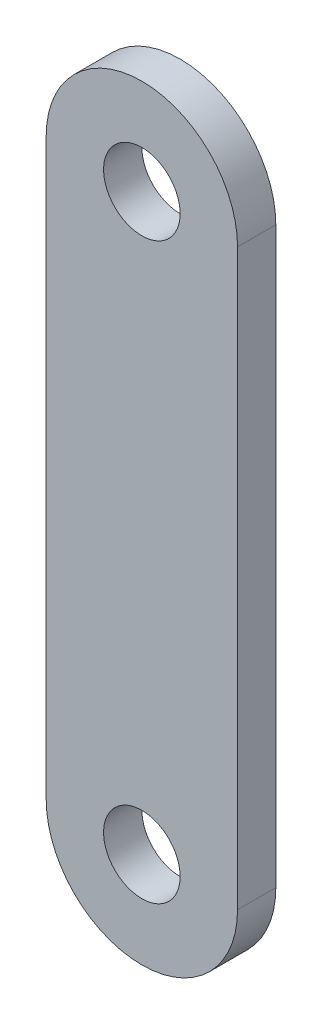
ISO-10303-21;
HEADER;
FILE_DESCRIPTION(('STEP AP214'),'2;1');
FILE_NAME('part.step','',(''),(''),'','','');
FILE_SCHEMA(('AUTOMOTIVE_DESIGN { 1 0 10303 214 1 1 1 1 }'));
ENDSEC;
DATA;
#1=APPLICATION_CONTEXT('core data for automotive mechanical design processes');
#2=APPLICATION_PROTOCOL_DEFINITION('international standard','automotive_design',2000,#1);
#3=PRODUCT_CONTEXT('',#1,'mechanical');
#4=PRODUCT('Part','Part','',(#3));
#5=PRODUCT_RELATED_PRODUCT_CATEGORY('part','',(#4));
#6=PRODUCT_DEFINITION_FORMATION('','',#4);
#7=PRODUCT_DEFINITION_CONTEXT('part definition',#1,'design');
#8=PRODUCT_DEFINITION('design','',#6,#7);
#9=PRODUCT_DEFINITION_SHAPE('','',#8);
#10=(LENGTH_UNIT() NAMED_UNIT(*) SI_UNIT(.MILLI.,.METRE.));
#11=(NAMED_UNIT(*) PLANE_ANGLE_UNIT() SI_UNIT($,.RADIAN.));
#12=(NAMED_UNIT(*) SI_UNIT($,.STERADIAN.) SOLID_ANGLE_UNIT());
#13=UNCERTAINTY_MEASURE_WITH_UNIT(LENGTH_MEASURE(1.E-05),#10,'distance_accuracy_value','');
#14=(GEOMETRIC_REPRESENTATION_CONTEXT(3) GLOBAL_UNCERTAINTY_ASSIGNED_CONTEXT((#13)) GLOBAL_UNIT_ASSIGNED_CONTEXT((#10,
#11,#12)) REPRESENTATION_CONTEXT('',''));
#15=CARTESIAN_POINT('',(0.,0.,0.));
#16=DIRECTION('',(0.,0.,1.));
#17=DIRECTION('',(1.,0.,0.));
#18=AXIS2_PLACEMENT_3D('',#15,#16,#17);
#19=CARTESIAN_POINT('',(25.,0.,10.));
#20=DIRECTION('',(0.,0.,1.));
#21=DIRECTION('',(1.,0.,0.));
#22=AXIS2_PLACEMENT_3D('',#19,#20,#21);
#23=PLANE('',#22);
#24=CARTESIAN_POINT('',(25.,150.,10.));
#25=DIRECTION('',(0.,0.,1.));
#26=DIRECTION('',(1.,0.,0.));
#27=AXIS2_PLACEMENT_3D('',#24,#25,#26);
#28=CIRCLE('',#27,10.);
#29=CARTESIAN_POINT('',(35.,150.,10.));
#30=VERTEX_POINT('',#29);
#31=EDGE_CURVE('E100',#30,#30,#28,.T.);
#32=ORIENTED_EDGE('',*,*,#31,.F.);
#33=EDGE_LOOP('',(#32));
#34=FACE_BOUND('',#33,.T.);
#35=CARTESIAN_POINT('',(25.,0.,10.));
#36=DIRECTION('',(0.,0.,1.));
#37=DIRECTION('',(1.,0.,0.));
#38=AXIS2_PLACEMENT_3D('',#35,#36,#37);
#39=CIRCLE('',#38,25.);
#40=CARTESIAN_POINT('',(0.,0.,10.));
#41=VERTEX_POINT('',#40);
#42=CARTESIAN_POINT('',(50.,0.,10.));
#43=VERTEX_POINT('',#42);
#44=EDGE_CURVE('E85',#41,#43,#39,.T.);
#45=ORIENTED_EDGE('',*,*,#44,.T.);
#46=DIRECTION('',(0.,1.,0.));
#47=VECTOR('',#46,1.);
#48=CARTESIAN_POINT('',(50.,0.,10.));
#49=LINE('',#48,#47);
#50=CARTESIAN_POINT('',(50.,150.,10.));
#51=VERTEX_POINT('',#50);
#52=EDGE_CURVE('E80',#43,#51,#49,.T.);
#53=ORIENTED_EDGE('',*,*,#52,.T.);
#54=CARTESIAN_POINT('',(25.,150.,10.));
#55=DIRECTION('',(0.,0.,1.));
#56=DIRECTION('',(1.,0.,0.));
#57=AXIS2_PLACEMENT_3D('',#54,#55,#56);
#58=CIRCLE('',#57,25.);
#59=CARTESIAN_POINT('',(0.,150.,10.));
#60=VERTEX_POINT('',#59);
#61=EDGE_CURVE('E83',#51,#60,#58,.T.);
#62=ORIENTED_EDGE('',*,*,#61,.T.);
#63=DIRECTION('',(0.,-1.,0.));
#64=VECTOR('',#63,1.);
#65=CARTESIAN_POINT('',(0.,150.,10.));
#66=LINE('',#65,#64);
#67=EDGE_CURVE('E50',#60,#41,#66,.T.);
#68=ORIENTED_EDGE('',*,*,#67,.T.);
#69=EDGE_LOOP('',(#45,#53,#62,#68));
#70=FACE_BOUND('',#69,.T.);
#71=CARTESIAN_POINT('',(25.,0.,10.));
#72=DIRECTION('',(0.,0.,1.));
#73=DIRECTION('',(1.,0.,0.));
#74=AXIS2_PLACEMENT_3D('',#71,#72,#73);
#75=CIRCLE('',#74,10.);
#76=CARTESIAN_POINT('',(35.,0.,10.));
#77=VERTEX_POINT('',#76);
#78=EDGE_CURVE('E115',#77,#77,#75,.T.);
#79=ORIENTED_EDGE('',*,*,#78,.F.);
#80=EDGE_LOOP('',(#79));
#81=FACE_BOUND('',#80,.T.);
#82=ADVANCED_FACE('F33',(#34,#70,#81),#23,.T.);
#83=CARTESIAN_POINT('',(25.,0.,0.));
#84=DIRECTION('',(0.,0.,1.));
#85=DIRECTION('',(1.,0.,0.));
#86=AXIS2_PLACEMENT_3D('',#83,#84,#85);
#87=PLANE('',#86);
#88=CARTESIAN_POINT('',(25.,150.,0.));
#89=DIRECTION('',(0.,0.,1.));
#90=DIRECTION('',(1.,0.,0.));
#91=AXIS2_PLACEMENT_3D('',#88,#89,#90);
#92=CIRCLE('',#91,10.);
#93=CARTESIAN_POINT('',(35.,150.,0.));
#94=VERTEX_POINT('',#93);
#95=EDGE_CURVE('E112',#94,#94,#92,.T.);
#96=ORIENTED_EDGE('',*,*,#95,.T.);
#97=EDGE_LOOP('',(#96));
#98=FACE_BOUND('',#97,.T.);
#99=CARTESIAN_POINT('',(25.,0.,0.));
#100=DIRECTION('',(0.,0.,1.));
#101=DIRECTION('',(1.,0.,0.));
#102=AXIS2_PLACEMENT_3D('',#99,#100,#101);
#103=CIRCLE('',#102,25.);
#104=CARTESIAN_POINT('',(0.,0.,0.));
#105=VERTEX_POINT('',#104);
#106=CARTESIAN_POINT('',(50.,0.,0.));
#107=VERTEX_POINT('',#106);
#108=EDGE_CURVE('E97',#105,#107,#103,.T.);
#109=ORIENTED_EDGE('',*,*,#108,.F.);
#110=DIRECTION('',(0.,-1.,0.));
#111=VECTOR('',#110,1.);
#112=CARTESIAN_POINT('',(0.,150.,0.));
#113=LINE('',#112,#111);
#114=CARTESIAN_POINT('',(0.,150.,0.));
#115=VERTEX_POINT('',#114);
#116=EDGE_CURVE('E73',#115,#105,#113,.T.);
#117=ORIENTED_EDGE('',*,*,#116,.F.);
#118=CARTESIAN_POINT('',(25.,150.,0.));
#119=DIRECTION('',(0.,0.,1.));
#120=DIRECTION('',(1.,0.,0.));
#121=AXIS2_PLACEMENT_3D('',#118,#119,#120);
#122=CIRCLE('',#121,25.);
#123=CARTESIAN_POINT('',(50.,150.,0.));
#124=VERTEX_POINT('',#123);
#125=EDGE_CURVE('E67',#124,#115,#122,.T.);
#126=ORIENTED_EDGE('',*,*,#125,.F.);
#127=DIRECTION('',(0.,1.,0.));
#128=VECTOR('',#127,1.);
#129=CARTESIAN_POINT('',(50.,0.,0.));
#130=LINE('',#129,#128);
#131=EDGE_CURVE('E89',#107,#124,#130,.T.);
#132=ORIENTED_EDGE('',*,*,#131,.F.);
#133=EDGE_LOOP('',(#109,#117,#126,#132));
#134=FACE_BOUND('',#133,.T.);
#135=CARTESIAN_POINT('',(25.,0.,0.));
#136=DIRECTION('',(0.,0.,1.));
#137=DIRECTION('',(1.,0.,0.));
#138=AXIS2_PLACEMENT_3D('',#135,#136,#137);
#139=CIRCLE('',#138,10.);
#140=CARTESIAN_POINT('',(35.,0.,0.));
#141=VERTEX_POINT('',#140);
#142=EDGE_CURVE('E118',#141,#141,#139,.T.);
#143=ORIENTED_EDGE('',*,*,#142,.T.);
#144=EDGE_LOOP('',(#143));
#145=FACE_BOUND('',#144,.T.);
#146=ADVANCED_FACE('F108',(#98,#134,#145),#87,.F.);
#147=CARTESIAN_POINT('',(25.,0.,10.));
#148=DIRECTION('',(0.,0.,-1.));
#149=DIRECTION('',(-1.,0.,0.));
#150=AXIS2_PLACEMENT_3D('',#147,#148,#149);
#151=CYLINDRICAL_SURFACE('',#150,25.);
#152=ORIENTED_EDGE('',*,*,#108,.T.);
#153=DIRECTION('',(0.,0.,-1.));
#154=VECTOR('',#153,1.);
#155=CARTESIAN_POINT('',(50.,0.,10.));
#156=LINE('',#155,#154);
#157=EDGE_CURVE('E11',#43,#107,#156,.T.);
#158=ORIENTED_EDGE('',*,*,#157,.F.);
#159=ORIENTED_EDGE('',*,*,#44,.F.);
#160=DIRECTION('',(0.,0.,-1.));
#161=VECTOR('',#160,1.);
#162=CARTESIAN_POINT('',(0.,0.,10.));
#163=LINE('',#162,#161);
#164=EDGE_CURVE('E93',#41,#105,#163,.T.);
#165=ORIENTED_EDGE('',*,*,#164,.T.);
#166=EDGE_LOOP('',(#152,#158,#159,#165));
#167=FACE_BOUND('',#166,.T.);
#168=ADVANCED_FACE('F35',(#167),#151,.T.);
#169=CARTESIAN_POINT('',(50.,0.,10.));
#170=DIRECTION('',(-1.,0.,0.));
#171=DIRECTION('',(0.,0.,1.));
#172=AXIS2_PLACEMENT_3D('',#169,#170,#171);
#173=PLANE('',#172);
#174=ORIENTED_EDGE('',*,*,#131,.T.);
#175=DIRECTION('',(0.,0.,-1.));
#176=VECTOR('',#175,1.);
#177=CARTESIAN_POINT('',(50.,150.,10.));
#178=LINE('',#177,#176);
#179=EDGE_CURVE('E42',#51,#124,#178,.T.);
#180=ORIENTED_EDGE('',*,*,#179,.F.);
#181=ORIENTED_EDGE('',*,*,#52,.F.);
#182=ORIENTED_EDGE('',*,*,#157,.T.);
#183=EDGE_LOOP('',(#174,#180,#181,#182));
#184=FACE_BOUND('',#183,.T.);
#185=ADVANCED_FACE('F88',(#184),#173,.F.);
#186=CARTESIAN_POINT('',(25.,150.,10.));
#187=DIRECTION('',(0.,0.,-1.));
#188=DIRECTION('',(-1.,0.,0.));
#189=AXIS2_PLACEMENT_3D('',#186,#187,#188);
#190=CYLINDRICAL_SURFACE('',#189,25.);
#191=ORIENTED_EDGE('',*,*,#125,.T.);
#192=DIRECTION('',(0.,0.,-1.));
#193=VECTOR('',#192,1.);
#194=CARTESIAN_POINT('',(0.,150.,10.));
#195=LINE('',#194,#193);
#196=EDGE_CURVE('E90',#60,#115,#195,.T.);
#197=ORIENTED_EDGE('',*,*,#196,.F.);
#198=ORIENTED_EDGE('',*,*,#61,.F.);
#199=ORIENTED_EDGE('',*,*,#179,.T.);
#200=EDGE_LOOP('',(#191,#197,#198,#199));
#201=FACE_BOUND('',#200,.T.);
#202=ADVANCED_FACE('F91',(#201),#190,.T.);
#203=CARTESIAN_POINT('',(0.,150.,10.));
#204=DIRECTION('',(1.,0.,0.));
#205=DIRECTION('',(0.,1.,0.));
#206=AXIS2_PLACEMENT_3D('',#203,#204,#205);
#207=PLANE('',#206);
#208=ORIENTED_EDGE('',*,*,#116,.T.);
#209=ORIENTED_EDGE('',*,*,#164,.F.);
#210=ORIENTED_EDGE('',*,*,#67,.F.);
#211=ORIENTED_EDGE('',*,*,#196,.T.);
#212=EDGE_LOOP('',(#208,#209,#210,#211));
#213=FACE_BOUND('',#212,.T.);
#214=ADVANCED_FACE('F105',(#213),#207,.F.);
#215=CARTESIAN_POINT('',(25.,150.,10.));
#216=DIRECTION('',(0.,0.,-1.));
#217=DIRECTION('',(-1.,0.,0.));
#218=AXIS2_PLACEMENT_3D('',#215,#216,#217);
#219=CYLINDRICAL_SURFACE('',#218,10.);
#220=ORIENTED_EDGE('',*,*,#31,.T.);
#221=EDGE_LOOP('',(#220));
#222=FACE_BOUND('',#221,.T.);
#223=ORIENTED_EDGE('',*,*,#95,.F.);
#224=EDGE_LOOP('',(#223));
#225=FACE_BOUND('',#224,.T.);
#226=ADVANCED_FACE('F136',(#222,#225),#219,.F.);
#227=CARTESIAN_POINT('',(25.,0.,10.));
#228=DIRECTION('',(0.,0.,-1.));
#229=DIRECTION('',(-1.,0.,0.));
#230=AXIS2_PLACEMENT_3D('',#227,#228,#229);
#231=CYLINDRICAL_SURFACE('',#230,10.);
#232=ORIENTED_EDGE('',*,*,#78,.T.);
#233=EDGE_LOOP('',(#232));
#234=FACE_BOUND('',#233,.T.);
#235=ORIENTED_EDGE('',*,*,#142,.F.);
#236=EDGE_LOOP('',(#235));
#237=FACE_BOUND('',#236,.T.);
#238=ADVANCED_FACE('F124',(#234,#237),#231,.F.);
#239=CLOSED_SHELL('',(#82,#146,#168,#185,#202,#214,#226,#238));
#240=MANIFOLD_SOLID_BREP('B2',#239);
#241=ADVANCED_BREP_SHAPE_REPRESENTATION('',(#18,#240),#14);
#242=SHAPE_DEFINITION_REPRESENTATION(#9,#241);
ENDSEC;
END-ISO-10303-21;
